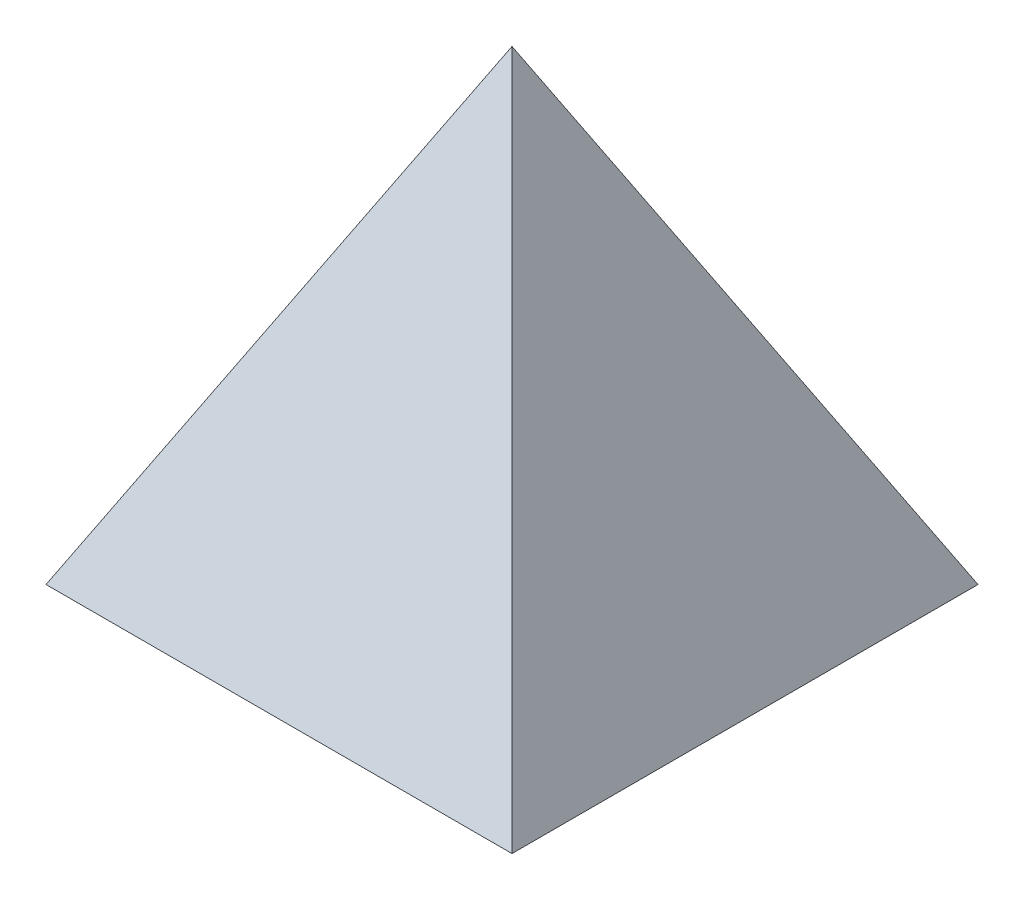
ISO-10303-21;
HEADER;
FILE_DESCRIPTION(('STEP AP214'),'2;1');
FILE_NAME('part.step','',(''),(''),'','','');
FILE_SCHEMA(('AUTOMOTIVE_DESIGN { 1 0 10303 214 1 1 1 1 }'));
ENDSEC;
DATA;
#1=APPLICATION_CONTEXT('core data for automotive mechanical design processes');
#2=APPLICATION_PROTOCOL_DEFINITION('international standard','automotive_design',2000,#1);
#3=PRODUCT_CONTEXT('',#1,'mechanical');
#4=PRODUCT('Part','Part','',(#3));
#5=PRODUCT_RELATED_PRODUCT_CATEGORY('part','',(#4));
#6=PRODUCT_DEFINITION_FORMATION('','',#4);
#7=PRODUCT_DEFINITION_CONTEXT('part definition',#1,'design');
#8=PRODUCT_DEFINITION('design','',#6,#7);
#9=PRODUCT_DEFINITION_SHAPE('','',#8);
#10=(LENGTH_UNIT() NAMED_UNIT(*) SI_UNIT(.MILLI.,.METRE.));
#11=(NAMED_UNIT(*) PLANE_ANGLE_UNIT() SI_UNIT($,.RADIAN.));
#12=(NAMED_UNIT(*) SI_UNIT($,.STERADIAN.) SOLID_ANGLE_UNIT());
#13=UNCERTAINTY_MEASURE_WITH_UNIT(LENGTH_MEASURE(1.E-05),#10,'distance_accuracy_value','');
#14=(GEOMETRIC_REPRESENTATION_CONTEXT(3) GLOBAL_UNCERTAINTY_ASSIGNED_CONTEXT((#13)) GLOBAL_UNIT_ASSIGNED_CONTEXT((#10,
#11,#12)) REPRESENTATION_CONTEXT('',''));
#15=CARTESIAN_POINT('',(0.,0.,0.));
#16=DIRECTION('',(0.,0.,1.));
#17=DIRECTION('',(1.,0.,0.));
#18=AXIS2_PLACEMENT_3D('',#15,#16,#17);
#19=CARTESIAN_POINT('',(0.,0.,-50.));
#20=DIRECTION('',(0.894427190999916,-0.447213595499958,0.));
#21=DIRECTION('',(0.447213595499958,0.894427190999916,0.));
#22=AXIS2_PLACEMENT_3D('',#19,#20,#21);
#23=PLANE('',#22);
#24=DIRECTION('',(0.408248290463863,0.816496580927726,0.408248290463863));
#25=VECTOR('',#24,1.);
#26=CARTESIAN_POINT('',(0.,0.,-50.));
#27=LINE('',#26,#25);
#28=CARTESIAN_POINT('',(0.,0.,-50.));
#29=VERTEX_POINT('',#28);
#30=CARTESIAN_POINT('',(25.,50.,-25.));
#31=VERTEX_POINT('',#30);
#32=EDGE_CURVE('E71',#29,#31,#27,.T.);
#33=ORIENTED_EDGE('',*,*,#32,.F.);
#34=DIRECTION('',(0.,0.,1.));
#35=VECTOR('',#34,1.);
#36=CARTESIAN_POINT('',(0.,0.,0.));
#37=LINE('',#36,#35);
#38=CARTESIAN_POINT('',(0.,0.,0.));
#39=VERTEX_POINT('',#38);
#40=EDGE_CURVE('E79',#29,#39,#37,.T.);
#41=ORIENTED_EDGE('',*,*,#40,.T.);
#42=DIRECTION('',(-0.408248290463863,-0.816496580927726,0.408248290463863));
#43=VECTOR('',#42,1.);
#44=CARTESIAN_POINT('',(8.33333333333333,16.6666666666667,-8.33333333333333));
#45=LINE('',#44,#43);
#46=EDGE_CURVE('E81',#31,#39,#45,.T.);
#47=ORIENTED_EDGE('',*,*,#46,.F.);
#48=EDGE_LOOP('',(#33,#41,#47));
#49=FACE_BOUND('',#48,.T.);
#50=ADVANCED_FACE('F43',(#49),#23,.F.);
#51=CARTESIAN_POINT('',(25.,50.,-50.));
#52=DIRECTION('',(-0.894427190999916,-0.447213595499958,0.));
#53=DIRECTION('',(0.447213595499958,-0.894427190999916,0.));
#54=AXIS2_PLACEMENT_3D('',#51,#52,#53);
#55=PLANE('',#54);
#56=DIRECTION('',(0.408248290463863,-0.816496580927726,-0.408248290463863));
#57=VECTOR('',#56,1.);
#58=CARTESIAN_POINT('',(29.1666666666667,41.6666666666667,-29.1666666666667));
#59=LINE('',#58,#57);
#60=CARTESIAN_POINT('',(50.,0.,-50.));
#61=VERTEX_POINT('',#60);
#62=EDGE_CURVE('E58',#31,#61,#59,.T.);
#63=ORIENTED_EDGE('',*,*,#62,.F.);
#64=DIRECTION('',(-0.408248290463863,0.816496580927726,-0.408248290463863));
#65=VECTOR('',#64,1.);
#66=CARTESIAN_POINT('',(20.8333333333333,58.3333333333333,-29.1666666666667));
#67=LINE('',#66,#65);
#68=CARTESIAN_POINT('',(50.,0.,0.));
#69=VERTEX_POINT('',#68);
#70=EDGE_CURVE('E11',#69,#31,#67,.T.);
#71=ORIENTED_EDGE('',*,*,#70,.F.);
#72=DIRECTION('',(0.,0.,-1.));
#73=VECTOR('',#72,1.);
#74=CARTESIAN_POINT('',(50.,0.,0.));
#75=LINE('',#74,#73);
#76=EDGE_CURVE('E75',#69,#61,#75,.T.);
#77=ORIENTED_EDGE('',*,*,#76,.T.);
#78=EDGE_LOOP('',(#63,#71,#77));
#79=FACE_BOUND('',#78,.T.);
#80=ADVANCED_FACE('F90',(#79),#55,.F.);
#81=CARTESIAN_POINT('',(0.,0.,0.));
#82=DIRECTION('',(0.,-1.,0.));
#83=DIRECTION('',(0.,0.,-1.));
#84=AXIS2_PLACEMENT_3D('',#81,#82,#83);
#85=PLANE('',#84);
#86=ORIENTED_EDGE('',*,*,#40,.F.);
#87=DIRECTION('',(-1.,0.,0.));
#88=VECTOR('',#87,1.);
#89=CARTESIAN_POINT('',(0.,0.,-50.));
#90=LINE('',#89,#88);
#91=EDGE_CURVE('E52',#61,#29,#90,.T.);
#92=ORIENTED_EDGE('',*,*,#91,.F.);
#93=ORIENTED_EDGE('',*,*,#76,.F.);
#94=DIRECTION('',(1.,0.,0.));
#95=VECTOR('',#94,1.);
#96=CARTESIAN_POINT('',(0.,0.,0.));
#97=LINE('',#96,#95);
#98=EDGE_CURVE('E83',#39,#69,#97,.T.);
#99=ORIENTED_EDGE('',*,*,#98,.F.);
#100=EDGE_LOOP('',(#86,#92,#93,#99));
#101=FACE_BOUND('',#100,.T.);
#102=ADVANCED_FACE('F45',(#101),#85,.T.);
#103=CARTESIAN_POINT('',(50.,0.,0.));
#104=DIRECTION('',(0.,0.447213595499958,0.894427190999916));
#105=DIRECTION('',(0.,-0.894427190999916,0.447213595499958));
#106=AXIS2_PLACEMENT_3D('',#103,#104,#105);
#107=PLANE('',#106);
#108=ORIENTED_EDGE('',*,*,#46,.T.);
#109=ORIENTED_EDGE('',*,*,#98,.T.);
#110=ORIENTED_EDGE('',*,*,#70,.T.);
#111=EDGE_LOOP('',(#108,#109,#110));
#112=FACE_BOUND('',#111,.T.);
#113=ADVANCED_FACE('F92',(#112),#107,.T.);
#114=CARTESIAN_POINT('',(50.,50.,-25.));
#115=DIRECTION('',(0.,0.447213595499958,-0.894427190999916));
#116=DIRECTION('',(0.,0.894427190999916,0.447213595499958));
#117=AXIS2_PLACEMENT_3D('',#114,#115,#116);
#118=PLANE('',#117);
#119=ORIENTED_EDGE('',*,*,#32,.T.);
#120=ORIENTED_EDGE('',*,*,#62,.T.);
#121=ORIENTED_EDGE('',*,*,#91,.T.);
#122=EDGE_LOOP('',(#119,#120,#121));
#123=FACE_BOUND('',#122,.T.);
#124=ADVANCED_FACE('F70',(#123),#118,.T.);
#125=CLOSED_SHELL('',(#50,#80,#102,#113,#124));
#126=MANIFOLD_SOLID_BREP('B2',#125);
#127=ADVANCED_BREP_SHAPE_REPRESENTATION('',(#18,#126),#14);
#128=SHAPE_DEFINITION_REPRESENTATION(#9,#127);
ENDSEC;
END-ISO-10303-21;
